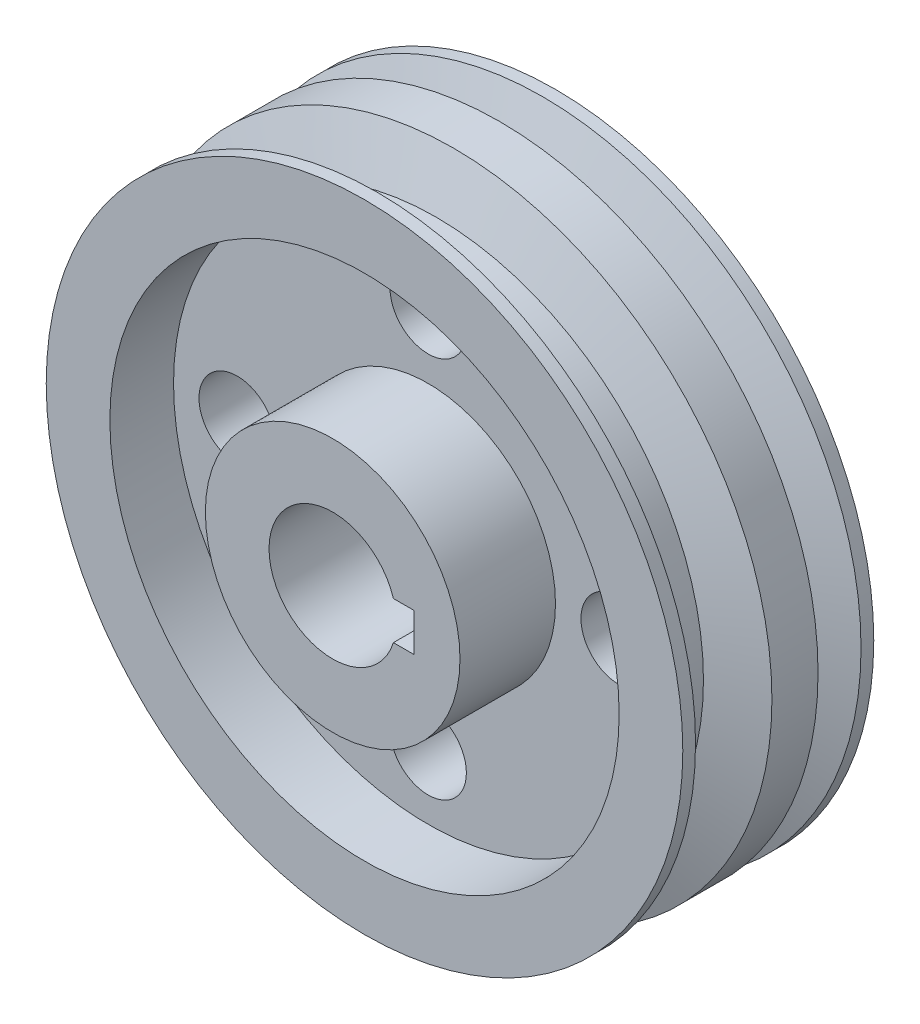
ISO-10303-21;
HEADER;
FILE_DESCRIPTION(('STEP AP214'),'2;1');
FILE_NAME('part.step','',(''),(''),'','','');
FILE_SCHEMA(('AUTOMOTIVE_DESIGN { 1 0 10303 214 1 1 1 1 }'));
ENDSEC;
DATA;
#1=APPLICATION_CONTEXT('core data for automotive mechanical design processes');
#2=APPLICATION_PROTOCOL_DEFINITION('international standard','automotive_design',2000,#1);
#3=PRODUCT_CONTEXT('',#1,'mechanical');
#4=PRODUCT('Part','Part','',(#3));
#5=PRODUCT_RELATED_PRODUCT_CATEGORY('part','',(#4));
#6=PRODUCT_DEFINITION_FORMATION('','',#4);
#7=PRODUCT_DEFINITION_CONTEXT('part definition',#1,'design');
#8=PRODUCT_DEFINITION('design','',#6,#7);
#9=PRODUCT_DEFINITION_SHAPE('','',#8);
#10=(LENGTH_UNIT() NAMED_UNIT(*) SI_UNIT(.MILLI.,.METRE.));
#11=(NAMED_UNIT(*) PLANE_ANGLE_UNIT() SI_UNIT($,.RADIAN.));
#12=(NAMED_UNIT(*) SI_UNIT($,.STERADIAN.) SOLID_ANGLE_UNIT());
#13=UNCERTAINTY_MEASURE_WITH_UNIT(LENGTH_MEASURE(1.E-05),#10,'distance_accuracy_value','');
#14=(GEOMETRIC_REPRESENTATION_CONTEXT(3) GLOBAL_UNCERTAINTY_ASSIGNED_CONTEXT((#13)) GLOBAL_UNIT_ASSIGNED_CONTEXT((#10,
#11,#12)) REPRESENTATION_CONTEXT('',''));
#15=CARTESIAN_POINT('',(0.,0.,0.));
#16=DIRECTION('',(0.,0.,1.));
#17=DIRECTION('',(1.,0.,0.));
#18=AXIS2_PLACEMENT_3D('',#15,#16,#17);
#19=CARTESIAN_POINT('',(0.,0.,-20.));
#20=DIRECTION('',(0.,0.,-1.));
#21=DIRECTION('',(-1.,0.,0.));
#22=AXIS2_PLACEMENT_3D('',#19,#20,#21);
#23=CYLINDRICAL_SURFACE('',#22,50.);
#24=CARTESIAN_POINT('',(0.,0.,15.));
#25=DIRECTION('',(0.,0.,-1.));
#26=DIRECTION('',(-1.,0.,0.));
#27=AXIS2_PLACEMENT_3D('',#24,#25,#26);
#28=CIRCLE('',#27,50.);
#29=CARTESIAN_POINT('',(-50.,0.,15.));
#30=VERTEX_POINT('',#29);
#31=EDGE_CURVE('E168',#30,#30,#28,.T.);
#32=ORIENTED_EDGE('',*,*,#31,.T.);
#33=EDGE_LOOP('',(#32));
#34=FACE_BOUND('',#33,.T.);
#35=CARTESIAN_POINT('',(0.,0.,12.9999988888889));
#36=DIRECTION('',(0.,0.,1.));
#37=DIRECTION('',(1.,0.,0.));
#38=AXIS2_PLACEMENT_3D('',#35,#36,#37);
#39=CIRCLE('',#38,50.);
#40=CARTESIAN_POINT('',(50.,0.,12.9999988888889));
#41=VERTEX_POINT('',#40);
#42=EDGE_CURVE('E198',#41,#41,#39,.F.);
#43=ORIENTED_EDGE('',*,*,#42,.F.);
#44=EDGE_LOOP('',(#43));
#45=FACE_BOUND('',#44,.T.);
#46=ADVANCED_FACE('F51',(#34,#45),#23,.T.);
#47=CARTESIAN_POINT('',(50.,0.,15.));
#48=DIRECTION('',(0.,0.,-1.));
#49=DIRECTION('',(-1.,0.,0.));
#50=AXIS2_PLACEMENT_3D('',#47,#48,#49);
#51=PLANE('',#50);
#52=ORIENTED_EDGE('',*,*,#31,.F.);
#53=EDGE_LOOP('',(#52));
#54=FACE_BOUND('',#53,.T.);
#55=CARTESIAN_POINT('',(0.,0.,15.));
#56=DIRECTION('',(0.,0.,-1.));
#57=DIRECTION('',(-1.,0.,0.));
#58=AXIS2_PLACEMENT_3D('',#55,#56,#57);
#59=CIRCLE('',#58,40.);
#60=CARTESIAN_POINT('',(-40.,0.,15.));
#61=VERTEX_POINT('',#60);
#62=EDGE_CURVE('E165',#61,#61,#59,.T.);
#63=ORIENTED_EDGE('',*,*,#62,.T.);
#64=EDGE_LOOP('',(#63));
#65=FACE_BOUND('',#64,.T.);
#66=ADVANCED_FACE('F261',(#54,#65),#51,.F.);
#67=CARTESIAN_POINT('',(0.,0.,-20.));
#68=DIRECTION('',(0.,0.,-1.));
#69=DIRECTION('',(-1.,0.,0.));
#70=AXIS2_PLACEMENT_3D('',#67,#68,#69);
#71=CYLINDRICAL_SURFACE('',#70,40.);
#72=ORIENTED_EDGE('',*,*,#62,.F.);
#73=EDGE_LOOP('',(#72));
#74=FACE_BOUND('',#73,.T.);
#75=CARTESIAN_POINT('',(0.,0.,5.));
#76=DIRECTION('',(0.,0.,-1.));
#77=DIRECTION('',(-1.,0.,0.));
#78=AXIS2_PLACEMENT_3D('',#75,#76,#77);
#79=CIRCLE('',#78,40.);
#80=CARTESIAN_POINT('',(-40.,0.,5.));
#81=VERTEX_POINT('',#80);
#82=EDGE_CURVE('E161',#81,#81,#79,.T.);
#83=ORIENTED_EDGE('',*,*,#82,.T.);
#84=EDGE_LOOP('',(#83));
#85=FACE_BOUND('',#84,.T.);
#86=ADVANCED_FACE('F267',(#74,#85),#71,.F.);
#87=CARTESIAN_POINT('',(40.,0.,5.));
#88=DIRECTION('',(0.,0.,-1.));
#89=DIRECTION('',(-1.,0.,0.));
#90=AXIS2_PLACEMENT_3D('',#87,#88,#89);
#91=PLANE('',#90);
#92=CARTESIAN_POINT('',(30.,0.,5.));
#93=DIRECTION('',(0.,0.,-1.));
#94=DIRECTION('',(-1.,0.,0.));
#95=AXIS2_PLACEMENT_3D('',#92,#93,#94);
#96=CIRCLE('',#95,6.);
#97=CARTESIAN_POINT('',(24.,0.,5.));
#98=VERTEX_POINT('',#97);
#99=EDGE_CURVE('E120',#98,#98,#96,.T.);
#100=ORIENTED_EDGE('',*,*,#99,.T.);
#101=EDGE_LOOP('',(#100));
#102=FACE_BOUND('',#101,.T.);
#103=CARTESIAN_POINT('',(0.,30.,5.));
#104=DIRECTION('',(0.,0.,-1.));
#105=DIRECTION('',(-1.,0.,0.));
#106=AXIS2_PLACEMENT_3D('',#103,#104,#105);
#107=CIRCLE('',#106,6.);
#108=CARTESIAN_POINT('',(-6.,30.,5.));
#109=VERTEX_POINT('',#108);
#110=EDGE_CURVE('E219',#109,#109,#107,.T.);
#111=ORIENTED_EDGE('',*,*,#110,.T.);
#112=EDGE_LOOP('',(#111));
#113=FACE_BOUND('',#112,.T.);
#114=CARTESIAN_POINT('',(-30.,0.,5.));
#115=DIRECTION('',(0.,0.,-1.));
#116=DIRECTION('',(-1.,0.,0.));
#117=AXIS2_PLACEMENT_3D('',#114,#115,#116);
#118=CIRCLE('',#117,6.);
#119=CARTESIAN_POINT('',(-36.,0.,5.));
#120=VERTEX_POINT('',#119);
#121=EDGE_CURVE('E215',#120,#120,#118,.T.);
#122=ORIENTED_EDGE('',*,*,#121,.T.);
#123=EDGE_LOOP('',(#122));
#124=FACE_BOUND('',#123,.T.);
#125=CARTESIAN_POINT('',(0.,-30.,5.));
#126=DIRECTION('',(0.,0.,-1.));
#127=DIRECTION('',(-1.,0.,0.));
#128=AXIS2_PLACEMENT_3D('',#125,#126,#127);
#129=CIRCLE('',#128,6.);
#130=CARTESIAN_POINT('',(-6.,-30.,5.));
#131=VERTEX_POINT('',#130);
#132=EDGE_CURVE('E209',#131,#131,#129,.T.);
#133=ORIENTED_EDGE('',*,*,#132,.T.);
#134=EDGE_LOOP('',(#133));
#135=FACE_BOUND('',#134,.T.);
#136=ORIENTED_EDGE('',*,*,#82,.F.);
#137=EDGE_LOOP('',(#136));
#138=FACE_BOUND('',#137,.T.);
#139=CARTESIAN_POINT('',(0.,0.,5.));
#140=DIRECTION('',(0.,0.,-1.));
#141=DIRECTION('',(-1.,0.,0.));
#142=AXIS2_PLACEMENT_3D('',#139,#140,#141);
#143=CIRCLE('',#142,20.);
#144=CARTESIAN_POINT('',(-20.,0.,5.));
#145=VERTEX_POINT('',#144);
#146=EDGE_CURVE('E157',#145,#145,#143,.T.);
#147=ORIENTED_EDGE('',*,*,#146,.T.);
#148=EDGE_LOOP('',(#147));
#149=FACE_BOUND('',#148,.T.);
#150=ADVANCED_FACE('F323',(#102,#113,#124,#135,#138,#149),#91,.F.);
#151=CARTESIAN_POINT('',(0.,0.,-20.));
#152=DIRECTION('',(0.,0.,-1.));
#153=DIRECTION('',(-1.,0.,0.));
#154=AXIS2_PLACEMENT_3D('',#151,#152,#153);
#155=CYLINDRICAL_SURFACE('',#154,20.);
#156=ORIENTED_EDGE('',*,*,#146,.F.);
#157=EDGE_LOOP('',(#156));
#158=FACE_BOUND('',#157,.T.);
#159=CARTESIAN_POINT('',(0.,0.,20.));
#160=DIRECTION('',(0.,0.,-1.));
#161=DIRECTION('',(-1.,0.,0.));
#162=AXIS2_PLACEMENT_3D('',#159,#160,#161);
#163=CIRCLE('',#162,20.);
#164=CARTESIAN_POINT('',(-20.,0.,20.));
#165=VERTEX_POINT('',#164);
#166=EDGE_CURVE('E153',#165,#165,#163,.T.);
#167=ORIENTED_EDGE('',*,*,#166,.T.);
#168=EDGE_LOOP('',(#167));
#169=FACE_BOUND('',#168,.T.);
#170=ADVANCED_FACE('F302',(#158,#169),#155,.T.);
#171=CARTESIAN_POINT('',(20.,0.,20.));
#172=DIRECTION('',(0.,0.,-1.));
#173=DIRECTION('',(-1.,0.,0.));
#174=AXIS2_PLACEMENT_3D('',#171,#172,#173);
#175=PLANE('',#174);
#176=DIRECTION('',(1.,0.,0.));
#177=VECTOR('',#176,1.);
#178=CARTESIAN_POINT('',(0.,-3.,20.));
#179=LINE('',#178,#177);
#180=CARTESIAN_POINT('',(9.53939201416946,-3.,20.));
#181=VERTEX_POINT('',#180);
#182=CARTESIAN_POINT('',(12.8,-3.,20.));
#183=VERTEX_POINT('',#182);
#184=EDGE_CURVE('E125',#181,#183,#179,.T.);
#185=ORIENTED_EDGE('',*,*,#184,.F.);
#186=CARTESIAN_POINT('',(0.,0.,20.));
#187=DIRECTION('',(0.,0.,-1.));
#188=DIRECTION('',(-1.,0.,0.));
#189=AXIS2_PLACEMENT_3D('',#186,#187,#188);
#190=CIRCLE('',#189,10.);
#191=CARTESIAN_POINT('',(9.53939201416946,3.,20.));
#192=VERTEX_POINT('',#191);
#193=EDGE_CURVE('E68',#181,#192,#190,.T.);
#194=ORIENTED_EDGE('',*,*,#193,.T.);
#195=DIRECTION('',(-1.,0.,0.));
#196=VECTOR('',#195,1.);
#197=CARTESIAN_POINT('',(12.8,3.,20.));
#198=LINE('',#197,#196);
#199=CARTESIAN_POINT('',(12.8,3.,20.));
#200=VERTEX_POINT('',#199);
#201=EDGE_CURVE('E109',#200,#192,#198,.T.);
#202=ORIENTED_EDGE('',*,*,#201,.F.);
#203=DIRECTION('',(0.,1.,0.));
#204=VECTOR('',#203,1.);
#205=CARTESIAN_POINT('',(12.8,-3.,20.));
#206=LINE('',#205,#204);
#207=EDGE_CURVE('E117',#183,#200,#206,.T.);
#208=ORIENTED_EDGE('',*,*,#207,.F.);
#209=EDGE_LOOP('',(#185,#194,#202,#208));
#210=FACE_BOUND('',#209,.T.);
#211=ORIENTED_EDGE('',*,*,#166,.F.);
#212=EDGE_LOOP('',(#211));
#213=FACE_BOUND('',#212,.T.);
#214=ADVANCED_FACE('F243',(#210,#213),#175,.F.);
#215=CARTESIAN_POINT('',(0.,0.,0.655670000000001));
#216=DIRECTION('',(0.,0.,-1.));
#217=DIRECTION('',(-1.,0.,0.));
#218=AXIS2_PLACEMENT_3D('',#215,#216,#217);
#219=CONICAL_SURFACE('',#218,51.,1.23918064184816);
#220=CARTESIAN_POINT('',(0.,0.,3.75465));
#221=DIRECTION('',(0.,0.,-1.));
#222=DIRECTION('',(-1.,0.,0.));
#223=AXIS2_PLACEMENT_3D('',#220,#221,#222);
#224=CIRCLE('',#223,42.);
#225=CARTESIAN_POINT('',(-42.,0.,3.75465));
#226=VERTEX_POINT('',#225);
#227=EDGE_CURVE('E141',#226,#226,#224,.T.);
#228=ORIENTED_EDGE('',*,*,#227,.T.);
#229=EDGE_LOOP('',(#228));
#230=FACE_BOUND('',#229,.T.);
#231=CARTESIAN_POINT('',(0.,0.,1.00000111111111));
#232=DIRECTION('',(0.,0.,-1.));
#233=DIRECTION('',(-1.,0.,0.));
#234=AXIS2_PLACEMENT_3D('',#231,#232,#233);
#235=CIRCLE('',#234,50.);
#236=CARTESIAN_POINT('',(-50.,0.,1.00000111111111));
#237=VERTEX_POINT('',#236);
#238=EDGE_CURVE('E158',#237,#237,#235,.F.);
#239=ORIENTED_EDGE('',*,*,#238,.T.);
#240=EDGE_LOOP('',(#239));
#241=FACE_BOUND('',#240,.T.);
#242=ADVANCED_FACE('F293',(#230,#241),#219,.T.);
#243=CARTESIAN_POINT('',(0.,0.,10.24535));
#244=DIRECTION('',(0.,0.,1.));
#245=DIRECTION('',(1.,0.,0.));
#246=AXIS2_PLACEMENT_3D('',#243,#244,#245);
#247=CONICAL_SURFACE('',#246,42.,1.23918064184816);
#248=CARTESIAN_POINT('',(0.,0.,10.24535));
#249=DIRECTION('',(0.,0.,-1.));
#250=DIRECTION('',(-1.,0.,0.));
#251=AXIS2_PLACEMENT_3D('',#248,#249,#250);
#252=CIRCLE('',#251,42.);
#253=CARTESIAN_POINT('',(-42.,0.,10.24535));
#254=VERTEX_POINT('',#253);
#255=EDGE_CURVE('E137',#254,#254,#252,.T.);
#256=ORIENTED_EDGE('',*,*,#255,.F.);
#257=EDGE_LOOP('',(#256));
#258=FACE_BOUND('',#257,.T.);
#259=ORIENTED_EDGE('',*,*,#42,.T.);
#260=EDGE_LOOP('',(#259));
#261=FACE_BOUND('',#260,.T.);
#262=ADVANCED_FACE('F286',(#258,#261),#247,.T.);
#263=CARTESIAN_POINT('',(0.,0.,-20.));
#264=DIRECTION('',(0.,0.,-1.));
#265=DIRECTION('',(-1.,0.,0.));
#266=AXIS2_PLACEMENT_3D('',#263,#264,#265);
#267=CYLINDRICAL_SURFACE('',#266,42.);
#268=ORIENTED_EDGE('',*,*,#255,.T.);
#269=EDGE_LOOP('',(#268));
#270=FACE_BOUND('',#269,.T.);
#271=ORIENTED_EDGE('',*,*,#227,.F.);
#272=EDGE_LOOP('',(#271));
#273=FACE_BOUND('',#272,.T.);
#274=ADVANCED_FACE('F278',(#270,#273),#267,.T.);
#275=CARTESIAN_POINT('',(0.,0.,-6.24444555555556));
#276=DIRECTION('',(0.,0.,-1.));
#277=DIRECTION('',(-1.,0.,0.));
#278=AXIS2_PLACEMENT_3D('',#275,#276,#277);
#279=CIRCLE('',#278,50.);
#280=CARTESIAN_POINT('',(-50.,0.,-6.24444555555556));
#281=VERTEX_POINT('',#280);
#282=EDGE_CURVE('E194',#281,#281,#279,.T.);
#283=ORIENTED_EDGE('',*,*,#282,.F.);
#284=EDGE_LOOP('',(#283));
#285=FACE_BOUND('',#284,.T.);
#286=ORIENTED_EDGE('',*,*,#238,.F.);
#287=EDGE_LOOP('',(#286));
#288=FACE_BOUND('',#287,.T.);
#289=ADVANCED_FACE('F264',(#285,#288),#23,.T.);
#290=CARTESIAN_POINT('',(0.,0.,-3.75465));
#291=DIRECTION('',(0.,0.,-1.));
#292=DIRECTION('',(-1.,0.,0.));
#293=AXIS2_PLACEMENT_3D('',#290,#291,#292);
#294=CONICAL_SURFACE('',#293,42.,1.26907395201829);
#295=CARTESIAN_POINT('',(0.,0.,-3.75465));
#296=DIRECTION('',(0.,0.,-1.));
#297=DIRECTION('',(-1.,0.,0.));
#298=AXIS2_PLACEMENT_3D('',#295,#296,#297);
#299=CIRCLE('',#298,42.);
#300=CARTESIAN_POINT('',(-42.,0.,-3.75465));
#301=VERTEX_POINT('',#300);
#302=EDGE_CURVE('E142',#301,#301,#299,.T.);
#303=ORIENTED_EDGE('',*,*,#302,.F.);
#304=EDGE_LOOP('',(#303));
#305=FACE_BOUND('',#304,.T.);
#306=ORIENTED_EDGE('',*,*,#282,.T.);
#307=EDGE_LOOP('',(#306));
#308=FACE_BOUND('',#307,.T.);
#309=ADVANCED_FACE('F277',(#305,#308),#294,.F.);
#310=CARTESIAN_POINT('',(0.,0.,-13.34433));
#311=DIRECTION('',(0.,0.,-1.));
#312=DIRECTION('',(-1.,0.,0.));
#313=AXIS2_PLACEMENT_3D('',#310,#311,#312);
#314=CONICAL_SURFACE('',#313,51.,1.23918064184816);
#315=CARTESIAN_POINT('',(0.,0.,-10.24535));
#316=DIRECTION('',(0.,0.,-1.));
#317=DIRECTION('',(-1.,0.,0.));
#318=AXIS2_PLACEMENT_3D('',#315,#316,#317);
#319=CIRCLE('',#318,42.);
#320=CARTESIAN_POINT('',(-42.,0.,-10.24535));
#321=VERTEX_POINT('',#320);
#322=EDGE_CURVE('E134',#321,#321,#319,.T.);
#323=ORIENTED_EDGE('',*,*,#322,.T.);
#324=EDGE_LOOP('',(#323));
#325=FACE_BOUND('',#324,.T.);
#326=CARTESIAN_POINT('',(0.,0.,-12.9999988888889));
#327=DIRECTION('',(0.,0.,-1.));
#328=DIRECTION('',(-1.,0.,0.));
#329=AXIS2_PLACEMENT_3D('',#326,#327,#328);
#330=CIRCLE('',#329,50.);
#331=CARTESIAN_POINT('',(-50.,0.,-12.9999988888889));
#332=VERTEX_POINT('',#331);
#333=EDGE_CURVE('E146',#332,#332,#330,.F.);
#334=ORIENTED_EDGE('',*,*,#333,.T.);
#335=EDGE_LOOP('',(#334));
#336=FACE_BOUND('',#335,.T.);
#337=ADVANCED_FACE('F283',(#325,#336),#314,.T.);
#338=CARTESIAN_POINT('',(0.,0.,-20.));
#339=DIRECTION('',(0.,0.,-1.));
#340=DIRECTION('',(-1.,0.,0.));
#341=AXIS2_PLACEMENT_3D('',#338,#339,#340);
#342=CYLINDRICAL_SURFACE('',#341,42.);
#343=ORIENTED_EDGE('',*,*,#302,.T.);
#344=EDGE_LOOP('',(#343));
#345=FACE_BOUND('',#344,.T.);
#346=ORIENTED_EDGE('',*,*,#322,.F.);
#347=EDGE_LOOP('',(#346));
#348=FACE_BOUND('',#347,.T.);
#349=ADVANCED_FACE('F313',(#345,#348),#342,.T.);
#350=CARTESIAN_POINT('',(0.,0.,-20.));
#351=DIRECTION('',(0.,0.,1.));
#352=DIRECTION('',(1.,0.,0.));
#353=AXIS2_PLACEMENT_3D('',#350,#351,#352);
#354=PLANE('',#353);
#355=DIRECTION('',(-1.,0.,0.));
#356=VECTOR('',#355,1.);
#357=CARTESIAN_POINT('',(12.8,3.,-20.));
#358=LINE('',#357,#356);
#359=CARTESIAN_POINT('',(12.8,3.,-20.));
#360=VERTEX_POINT('',#359);
#361=CARTESIAN_POINT('',(9.53939201416946,3.,-20.));
#362=VERTEX_POINT('',#361);
#363=EDGE_CURVE('E100',#360,#362,#358,.T.);
#364=ORIENTED_EDGE('',*,*,#363,.T.);
#365=CARTESIAN_POINT('',(0.,0.,-20.));
#366=DIRECTION('',(0.,0.,1.));
#367=DIRECTION('',(1.,0.,0.));
#368=AXIS2_PLACEMENT_3D('',#365,#366,#367);
#369=CIRCLE('',#368,10.);
#370=CARTESIAN_POINT('',(9.53939201416946,-3.,-20.));
#371=VERTEX_POINT('',#370);
#372=EDGE_CURVE('E93',#362,#371,#369,.T.);
#373=ORIENTED_EDGE('',*,*,#372,.T.);
#374=DIRECTION('',(1.,0.,0.));
#375=VECTOR('',#374,1.);
#376=CARTESIAN_POINT('',(0.,-3.,-20.));
#377=LINE('',#376,#375);
#378=CARTESIAN_POINT('',(12.8,-3.,-20.));
#379=VERTEX_POINT('',#378);
#380=EDGE_CURVE('E75',#371,#379,#377,.T.);
#381=ORIENTED_EDGE('',*,*,#380,.T.);
#382=DIRECTION('',(0.,1.,0.));
#383=VECTOR('',#382,1.);
#384=CARTESIAN_POINT('',(12.8,-3.,-20.));
#385=LINE('',#384,#383);
#386=EDGE_CURVE('E108',#379,#360,#385,.T.);
#387=ORIENTED_EDGE('',*,*,#386,.T.);
#388=EDGE_LOOP('',(#364,#373,#381,#387));
#389=FACE_BOUND('',#388,.T.);
#390=CARTESIAN_POINT('',(0.,0.,-20.));
#391=DIRECTION('',(0.,0.,-1.));
#392=DIRECTION('',(-1.,0.,0.));
#393=AXIS2_PLACEMENT_3D('',#390,#391,#392);
#394=CIRCLE('',#393,20.);
#395=CARTESIAN_POINT('',(-20.,0.,-20.));
#396=VERTEX_POINT('',#395);
#397=EDGE_CURVE('E61',#396,#396,#394,.T.);
#398=ORIENTED_EDGE('',*,*,#397,.T.);
#399=EDGE_LOOP('',(#398));
#400=FACE_BOUND('',#399,.T.);
#401=ADVANCED_FACE('F54',(#389,#400),#354,.F.);
#402=CARTESIAN_POINT('',(0.,0.,-20.));
#403=DIRECTION('',(0.,0.,-1.));
#404=DIRECTION('',(-1.,0.,0.));
#405=AXIS2_PLACEMENT_3D('',#402,#403,#404);
#406=CYLINDRICAL_SURFACE('',#405,20.);
#407=ORIENTED_EDGE('',*,*,#397,.F.);
#408=EDGE_LOOP('',(#407));
#409=FACE_BOUND('',#408,.T.);
#410=CARTESIAN_POINT('',(0.,0.,-5.));
#411=DIRECTION('',(0.,0.,-1.));
#412=DIRECTION('',(-1.,0.,0.));
#413=AXIS2_PLACEMENT_3D('',#410,#411,#412);
#414=CIRCLE('',#413,20.);
#415=CARTESIAN_POINT('',(-20.,0.,-5.));
#416=VERTEX_POINT('',#415);
#417=EDGE_CURVE('E184',#416,#416,#414,.T.);
#418=ORIENTED_EDGE('',*,*,#417,.T.);
#419=EDGE_LOOP('',(#418));
#420=FACE_BOUND('',#419,.T.);
#421=ADVANCED_FACE('F385',(#409,#420),#406,.T.);
#422=CARTESIAN_POINT('',(20.,0.,-5.));
#423=DIRECTION('',(0.,0.,1.));
#424=DIRECTION('',(1.,0.,0.));
#425=AXIS2_PLACEMENT_3D('',#422,#423,#424);
#426=PLANE('',#425);
#427=CARTESIAN_POINT('',(30.,0.,-5.));
#428=DIRECTION('',(0.,0.,1.));
#429=DIRECTION('',(1.,0.,0.));
#430=AXIS2_PLACEMENT_3D('',#427,#428,#429);
#431=CIRCLE('',#430,6.);
#432=CARTESIAN_POINT('',(36.,0.,-5.));
#433=VERTEX_POINT('',#432);
#434=EDGE_CURVE('E220',#433,#433,#431,.T.);
#435=ORIENTED_EDGE('',*,*,#434,.T.);
#436=EDGE_LOOP('',(#435));
#437=FACE_BOUND('',#436,.T.);
#438=CARTESIAN_POINT('',(0.,30.,-5.));
#439=DIRECTION('',(0.,0.,1.));
#440=DIRECTION('',(1.,0.,0.));
#441=AXIS2_PLACEMENT_3D('',#438,#439,#440);
#442=CIRCLE('',#441,6.);
#443=CARTESIAN_POINT('',(6.,30.,-5.));
#444=VERTEX_POINT('',#443);
#445=EDGE_CURVE('E216',#444,#444,#442,.T.);
#446=ORIENTED_EDGE('',*,*,#445,.T.);
#447=EDGE_LOOP('',(#446));
#448=FACE_BOUND('',#447,.T.);
#449=CARTESIAN_POINT('',(-30.,0.,-5.));
#450=DIRECTION('',(0.,0.,1.));
#451=DIRECTION('',(1.,0.,0.));
#452=AXIS2_PLACEMENT_3D('',#449,#450,#451);
#453=CIRCLE('',#452,6.);
#454=CARTESIAN_POINT('',(-24.,0.,-5.));
#455=VERTEX_POINT('',#454);
#456=EDGE_CURVE('E211',#455,#455,#453,.T.);
#457=ORIENTED_EDGE('',*,*,#456,.T.);
#458=EDGE_LOOP('',(#457));
#459=FACE_BOUND('',#458,.T.);
#460=CARTESIAN_POINT('',(0.,-30.,-5.));
#461=DIRECTION('',(0.,0.,1.));
#462=DIRECTION('',(1.,0.,0.));
#463=AXIS2_PLACEMENT_3D('',#460,#461,#462);
#464=CIRCLE('',#463,6.);
#465=CARTESIAN_POINT('',(6.,-30.,-5.));
#466=VERTEX_POINT('',#465);
#467=EDGE_CURVE('E205',#466,#466,#464,.T.);
#468=ORIENTED_EDGE('',*,*,#467,.T.);
#469=EDGE_LOOP('',(#468));
#470=FACE_BOUND('',#469,.T.);
#471=ORIENTED_EDGE('',*,*,#417,.F.);
#472=EDGE_LOOP('',(#471));
#473=FACE_BOUND('',#472,.T.);
#474=CARTESIAN_POINT('',(0.,0.,-5.));
#475=DIRECTION('',(0.,0.,-1.));
#476=DIRECTION('',(-1.,0.,0.));
#477=AXIS2_PLACEMENT_3D('',#474,#475,#476);
#478=CIRCLE('',#477,40.);
#479=CARTESIAN_POINT('',(-40.,0.,-5.));
#480=VERTEX_POINT('',#479);
#481=EDGE_CURVE('E180',#480,#480,#478,.T.);
#482=ORIENTED_EDGE('',*,*,#481,.T.);
#483=EDGE_LOOP('',(#482));
#484=FACE_BOUND('',#483,.T.);
#485=ADVANCED_FACE('F392',(#437,#448,#459,#470,#473,#484),#426,.F.);
#486=CARTESIAN_POINT('',(0.,0.,-20.));
#487=DIRECTION('',(0.,0.,-1.));
#488=DIRECTION('',(-1.,0.,0.));
#489=AXIS2_PLACEMENT_3D('',#486,#487,#488);
#490=CYLINDRICAL_SURFACE('',#489,40.);
#491=ORIENTED_EDGE('',*,*,#481,.F.);
#492=EDGE_LOOP('',(#491));
#493=FACE_BOUND('',#492,.T.);
#494=CARTESIAN_POINT('',(0.,0.,-15.));
#495=DIRECTION('',(0.,0.,-1.));
#496=DIRECTION('',(-1.,0.,0.));
#497=AXIS2_PLACEMENT_3D('',#494,#495,#496);
#498=CIRCLE('',#497,40.);
#499=CARTESIAN_POINT('',(-40.,0.,-15.));
#500=VERTEX_POINT('',#499);
#501=EDGE_CURVE('E176',#500,#500,#498,.T.);
#502=ORIENTED_EDGE('',*,*,#501,.T.);
#503=EDGE_LOOP('',(#502));
#504=FACE_BOUND('',#503,.T.);
#505=ADVANCED_FACE('F400',(#493,#504),#490,.F.);
#506=CARTESIAN_POINT('',(40.,0.,-15.));
#507=DIRECTION('',(0.,0.,1.));
#508=DIRECTION('',(1.,0.,0.));
#509=AXIS2_PLACEMENT_3D('',#506,#507,#508);
#510=PLANE('',#509);
#511=ORIENTED_EDGE('',*,*,#501,.F.);
#512=EDGE_LOOP('',(#511));
#513=FACE_BOUND('',#512,.T.);
#514=CARTESIAN_POINT('',(0.,0.,-15.));
#515=DIRECTION('',(0.,0.,-1.));
#516=DIRECTION('',(-1.,0.,0.));
#517=AXIS2_PLACEMENT_3D('',#514,#515,#516);
#518=CIRCLE('',#517,50.);
#519=CARTESIAN_POINT('',(-50.,0.,-15.));
#520=VERTEX_POINT('',#519);
#521=EDGE_CURVE('E172',#520,#520,#518,.T.);
#522=ORIENTED_EDGE('',*,*,#521,.T.);
#523=EDGE_LOOP('',(#522));
#524=FACE_BOUND('',#523,.T.);
#525=ADVANCED_FACE('F274',(#513,#524),#510,.F.);
#526=ORIENTED_EDGE('',*,*,#521,.F.);
#527=EDGE_LOOP('',(#526));
#528=FACE_BOUND('',#527,.T.);
#529=ORIENTED_EDGE('',*,*,#333,.F.);
#530=EDGE_LOOP('',(#529));
#531=FACE_BOUND('',#530,.T.);
#532=ADVANCED_FACE('F257',(#528,#531),#23,.T.);
#533=CARTESIAN_POINT('',(12.8,3.,-20.));
#534=DIRECTION('',(0.,1.,0.));
#535=DIRECTION('',(0.,0.,1.));
#536=AXIS2_PLACEMENT_3D('',#533,#534,#535);
#537=PLANE('',#536);
#538=ORIENTED_EDGE('',*,*,#201,.T.);
#539=DIRECTION('',(0.,0.,1.));
#540=VECTOR('',#539,1.);
#541=CARTESIAN_POINT('',(9.53939201416946,3.,-81.));
#542=LINE('',#541,#540);
#543=EDGE_CURVE('E210',#192,#362,#542,.F.);
#544=ORIENTED_EDGE('',*,*,#543,.T.);
#545=ORIENTED_EDGE('',*,*,#363,.F.);
#546=DIRECTION('',(0.,0.,1.));
#547=VECTOR('',#546,1.);
#548=CARTESIAN_POINT('',(12.8,3.,-20.));
#549=LINE('',#548,#547);
#550=EDGE_CURVE('E131',#360,#200,#549,.T.);
#551=ORIENTED_EDGE('',*,*,#550,.T.);
#552=EDGE_LOOP('',(#538,#544,#545,#551));
#553=FACE_BOUND('',#552,.T.);
#554=ADVANCED_FACE('F247',(#553),#537,.F.);
#555=CARTESIAN_POINT('',(12.8,-3.,-20.));
#556=DIRECTION('',(1.,0.,0.));
#557=DIRECTION('',(0.,0.,-1.));
#558=AXIS2_PLACEMENT_3D('',#555,#556,#557);
#559=PLANE('',#558);
#560=ORIENTED_EDGE('',*,*,#207,.T.);
#561=ORIENTED_EDGE('',*,*,#550,.F.);
#562=ORIENTED_EDGE('',*,*,#386,.F.);
#563=DIRECTION('',(0.,0.,1.));
#564=VECTOR('',#563,1.);
#565=CARTESIAN_POINT('',(12.8,-3.,-20.));
#566=LINE('',#565,#564);
#567=EDGE_CURVE('E106',#379,#183,#566,.T.);
#568=ORIENTED_EDGE('',*,*,#567,.T.);
#569=EDGE_LOOP('',(#560,#561,#562,#568));
#570=FACE_BOUND('',#569,.T.);
#571=ADVANCED_FACE('F249',(#570),#559,.F.);
#572=CARTESIAN_POINT('',(0.,-3.,-20.));
#573=DIRECTION('',(0.,-1.,0.));
#574=DIRECTION('',(0.,0.,-1.));
#575=AXIS2_PLACEMENT_3D('',#572,#573,#574);
#576=PLANE('',#575);
#577=ORIENTED_EDGE('',*,*,#380,.F.);
#578=DIRECTION('',(0.,0.,1.));
#579=VECTOR('',#578,1.);
#580=CARTESIAN_POINT('',(9.53939201416946,-3.,-81.));
#581=LINE('',#580,#579);
#582=EDGE_CURVE('E11',#371,#181,#581,.T.);
#583=ORIENTED_EDGE('',*,*,#582,.T.);
#584=ORIENTED_EDGE('',*,*,#184,.T.);
#585=ORIENTED_EDGE('',*,*,#567,.F.);
#586=EDGE_LOOP('',(#577,#583,#584,#585));
#587=FACE_BOUND('',#586,.T.);
#588=ADVANCED_FACE('F104',(#587),#576,.F.);
#589=CARTESIAN_POINT('',(0.,-30.,-20.));
#590=DIRECTION('',(0.,0.,1.));
#591=DIRECTION('',(1.,0.,0.));
#592=AXIS2_PLACEMENT_3D('',#589,#590,#591);
#593=CYLINDRICAL_SURFACE('',#592,6.);
#594=ORIENTED_EDGE('',*,*,#467,.F.);
#595=EDGE_LOOP('',(#594));
#596=FACE_BOUND('',#595,.T.);
#597=ORIENTED_EDGE('',*,*,#132,.F.);
#598=EDGE_LOOP('',(#597));
#599=FACE_BOUND('',#598,.T.);
#600=ADVANCED_FACE('F255',(#596,#599),#593,.F.);
#601=CARTESIAN_POINT('',(-30.,0.,-20.));
#602=DIRECTION('',(0.,0.,1.));
#603=DIRECTION('',(1.,0.,0.));
#604=AXIS2_PLACEMENT_3D('',#601,#602,#603);
#605=CYLINDRICAL_SURFACE('',#604,6.);
#606=ORIENTED_EDGE('',*,*,#456,.F.);
#607=EDGE_LOOP('',(#606));
#608=FACE_BOUND('',#607,.T.);
#609=ORIENTED_EDGE('',*,*,#121,.F.);
#610=EDGE_LOOP('',(#609));
#611=FACE_BOUND('',#610,.T.);
#612=ADVANCED_FACE('F434',(#608,#611),#605,.F.);
#613=CARTESIAN_POINT('',(0.,30.,-20.));
#614=DIRECTION('',(0.,0.,1.));
#615=DIRECTION('',(1.,0.,0.));
#616=AXIS2_PLACEMENT_3D('',#613,#614,#615);
#617=CYLINDRICAL_SURFACE('',#616,6.);
#618=ORIENTED_EDGE('',*,*,#445,.F.);
#619=EDGE_LOOP('',(#618));
#620=FACE_BOUND('',#619,.T.);
#621=ORIENTED_EDGE('',*,*,#110,.F.);
#622=EDGE_LOOP('',(#621));
#623=FACE_BOUND('',#622,.T.);
#624=ADVANCED_FACE('F442',(#620,#623),#617,.F.);
#625=CARTESIAN_POINT('',(30.,0.,-20.));
#626=DIRECTION('',(0.,0.,1.));
#627=DIRECTION('',(1.,0.,0.));
#628=AXIS2_PLACEMENT_3D('',#625,#626,#627);
#629=CYLINDRICAL_SURFACE('',#628,6.);
#630=ORIENTED_EDGE('',*,*,#434,.F.);
#631=EDGE_LOOP('',(#630));
#632=FACE_BOUND('',#631,.T.);
#633=ORIENTED_EDGE('',*,*,#99,.F.);
#634=EDGE_LOOP('',(#633));
#635=FACE_BOUND('',#634,.T.);
#636=ADVANCED_FACE('F450',(#632,#635),#629,.F.);
#637=CARTESIAN_POINT('',(0.,0.,-81.));
#638=DIRECTION('',(0.,0.,1.));
#639=DIRECTION('',(1.,0.,0.));
#640=AXIS2_PLACEMENT_3D('',#637,#638,#639);
#641=CYLINDRICAL_SURFACE('',#640,10.);
#642=ORIENTED_EDGE('',*,*,#193,.F.);
#643=ORIENTED_EDGE('',*,*,#582,.F.);
#644=ORIENTED_EDGE('',*,*,#372,.F.);
#645=ORIENTED_EDGE('',*,*,#543,.F.);
#646=EDGE_LOOP('',(#642,#643,#644,#645));
#647=FACE_BOUND('',#646,.T.);
#648=ADVANCED_FACE('F92',(#647),#641,.F.);
#649=CLOSED_SHELL('',(#46,#66,#86,#150,#170,#214,#242,#262,#274,#289,#309,#337,#349,#401,#421,
#485,#505,#525,#532,#554,#571,#588,#600,#612,#624,#636,#648));
#650=MANIFOLD_SOLID_BREP('B2',#649);
#651=ADVANCED_BREP_SHAPE_REPRESENTATION('',(#18,#650),#14);
#652=SHAPE_DEFINITION_REPRESENTATION(#9,#651);
ENDSEC;
END-ISO-10303-21;
